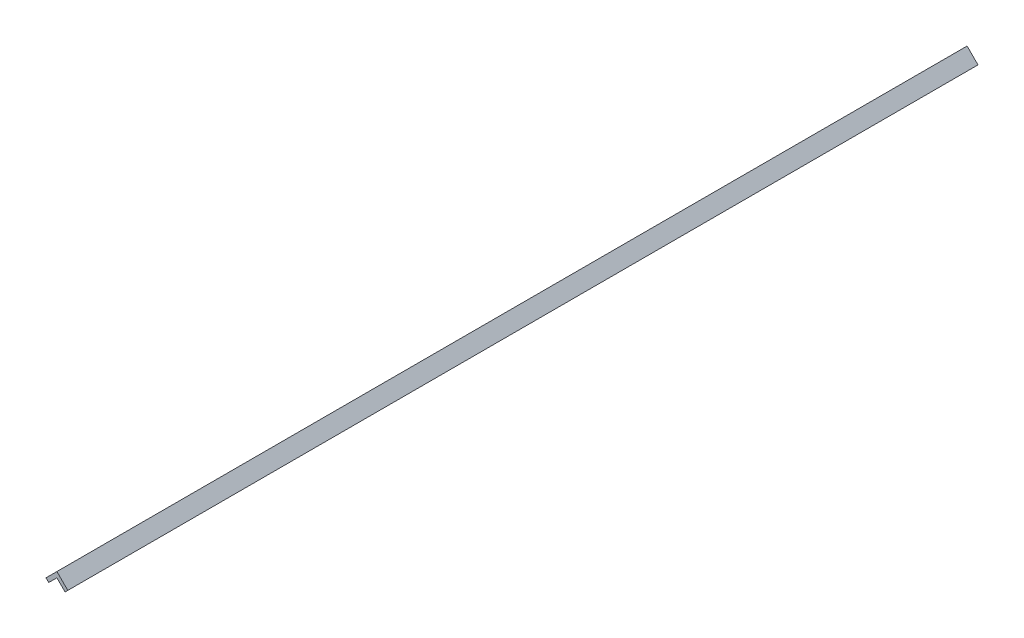
ISO-10303-21;
HEADER;
FILE_DESCRIPTION(('STEP AP214'),'2;1');
FILE_NAME('part.step','',(''),(''),'','','');
FILE_SCHEMA(('AUTOMOTIVE_DESIGN { 1 0 10303 214 1 1 1 1 }'));
ENDSEC;
DATA;
#1=APPLICATION_CONTEXT('core data for automotive mechanical design processes');
#2=APPLICATION_PROTOCOL_DEFINITION('international standard','automotive_design',2000,#1);
#3=PRODUCT_CONTEXT('',#1,'mechanical');
#4=PRODUCT('Part','Part','',(#3));
#5=PRODUCT_RELATED_PRODUCT_CATEGORY('part','',(#4));
#6=PRODUCT_DEFINITION_FORMATION('','',#4);
#7=PRODUCT_DEFINITION_CONTEXT('part definition',#1,'design');
#8=PRODUCT_DEFINITION('design','',#6,#7);
#9=PRODUCT_DEFINITION_SHAPE('','',#8);
#10=(LENGTH_UNIT() NAMED_UNIT(*) SI_UNIT(.MILLI.,.METRE.));
#11=(NAMED_UNIT(*) PLANE_ANGLE_UNIT() SI_UNIT($,.RADIAN.));
#12=(NAMED_UNIT(*) SI_UNIT($,.STERADIAN.) SOLID_ANGLE_UNIT());
#13=UNCERTAINTY_MEASURE_WITH_UNIT(LENGTH_MEASURE(1.E-05),#10,'distance_accuracy_value','');
#14=(GEOMETRIC_REPRESENTATION_CONTEXT(3) GLOBAL_UNCERTAINTY_ASSIGNED_CONTEXT((#13)) GLOBAL_UNIT_ASSIGNED_CONTEXT((#10,
#11,#12)) REPRESENTATION_CONTEXT('',''));
#15=CARTESIAN_POINT('',(0.,0.,0.));
#16=DIRECTION('',(0.,0.,1.));
#17=DIRECTION('',(1.,0.,0.));
#18=AXIS2_PLACEMENT_3D('',#15,#16,#17);
#19=CARTESIAN_POINT('',(0.,11.2288556852424,750.));
#20=DIRECTION('',(0.707106781186547,-0.707106781186548,0.));
#21=DIRECTION('',(0.707106781186548,0.707106781186547,0.));
#22=AXIS2_PLACEMENT_3D('',#19,#20,#21);
#23=PLANE('',#22);
#24=DIRECTION('',(-0.707106781186548,-0.707106781186547,0.));
#25=VECTOR('',#24,1.);
#26=CARTESIAN_POINT('',(0.,11.2288556852424,0.));
#27=LINE('',#26,#25);
#28=CARTESIAN_POINT('',(0.,11.2288556852424,0.));
#29=VERTEX_POINT('',#28);
#30=CARTESIAN_POINT('',(-8.98025612106915,2.24859956417322,0.));
#31=VERTEX_POINT('',#30);
#32=EDGE_CURVE('E119',#29,#31,#27,.T.);
#33=ORIENTED_EDGE('',*,*,#32,.T.);
#34=DIRECTION('',(0.,0.,-1.));
#35=VECTOR('',#34,1.);
#36=CARTESIAN_POINT('',(-8.98025612106906,2.24859956417322,750.));
#37=LINE('',#36,#35);
#38=CARTESIAN_POINT('',(-8.98025612106906,2.24859956417322,750.));
#39=VERTEX_POINT('',#38);
#40=EDGE_CURVE('E11',#39,#31,#37,.T.);
#41=ORIENTED_EDGE('',*,*,#40,.F.);
#42=DIRECTION('',(-0.707106781186548,-0.707106781186547,0.));
#43=VECTOR('',#42,1.);
#44=CARTESIAN_POINT('',(0.,11.2288556852424,750.));
#45=LINE('',#44,#43);
#46=CARTESIAN_POINT('',(0.,11.2288556852424,750.));
#47=VERTEX_POINT('',#46);
#48=EDGE_CURVE('E129',#47,#39,#45,.T.);
#49=ORIENTED_EDGE('',*,*,#48,.F.);
#50=DIRECTION('',(0.,0.,-1.));
#51=VECTOR('',#50,1.);
#52=CARTESIAN_POINT('',(0.,11.2288556852424,750.));
#53=LINE('',#52,#51);
#54=EDGE_CURVE('E115',#47,#29,#53,.T.);
#55=ORIENTED_EDGE('',*,*,#54,.T.);
#56=EDGE_LOOP('',(#33,#41,#49,#55));
#57=FACE_BOUND('',#56,.T.);
#58=ADVANCED_FACE('F35',(#57),#23,.F.);
#59=CARTESIAN_POINT('',(-8.98025612106906,2.24859956417322,750.));
#60=DIRECTION('',(0.707106781186548,0.707106781186547,0.));
#61=DIRECTION('',(-0.707106781186547,0.707106781186548,0.));
#62=AXIS2_PLACEMENT_3D('',#59,#60,#61);
#63=PLANE('',#62);
#64=DIRECTION('',(0.707106781186547,-0.707106781186548,0.));
#65=VECTOR('',#64,1.);
#66=CARTESIAN_POINT('',(-8.98025612106915,2.24859956417322,0.));
#67=LINE('',#66,#65);
#68=CARTESIAN_POINT('',(-6.73165655689593,0.,0.));
#69=VERTEX_POINT('',#68);
#70=EDGE_CURVE('E122',#31,#69,#67,.T.);
#71=ORIENTED_EDGE('',*,*,#70,.T.);
#72=DIRECTION('',(0.,0.,-1.));
#73=VECTOR('',#72,1.);
#74=CARTESIAN_POINT('',(-6.73165655689584,0.,750.));
#75=LINE('',#74,#73);
#76=CARTESIAN_POINT('',(-6.73165655689584,0.,750.));
#77=VERTEX_POINT('',#76);
#78=EDGE_CURVE('E43',#77,#69,#75,.T.);
#79=ORIENTED_EDGE('',*,*,#78,.F.);
#80=DIRECTION('',(0.707106781186547,-0.707106781186548,0.));
#81=VECTOR('',#80,1.);
#82=CARTESIAN_POINT('',(-8.98025612106906,2.24859956417322,750.));
#83=LINE('',#82,#81);
#84=EDGE_CURVE('E88',#39,#77,#83,.T.);
#85=ORIENTED_EDGE('',*,*,#84,.F.);
#86=ORIENTED_EDGE('',*,*,#40,.T.);
#87=EDGE_LOOP('',(#71,#79,#85,#86));
#88=FACE_BOUND('',#87,.T.);
#89=ADVANCED_FACE('F153',(#88),#63,.F.);
#90=CARTESIAN_POINT('',(-6.73165655689584,0.,750.));
#91=DIRECTION('',(-0.707106781186548,0.707106781186547,0.));
#92=DIRECTION('',(-0.707106781186547,-0.707106781186548,0.));
#93=AXIS2_PLACEMENT_3D('',#90,#91,#92);
#94=PLANE('',#93);
#95=DIRECTION('',(0.707106781186547,0.707106781186548,0.));
#96=VECTOR('',#95,1.);
#97=CARTESIAN_POINT('',(-6.73165655689593,0.,0.));
#98=LINE('',#97,#96);
#99=CARTESIAN_POINT('',(0.,6.73165655689594,0.));
#100=VERTEX_POINT('',#99);
#101=EDGE_CURVE('E124',#69,#100,#98,.T.);
#102=ORIENTED_EDGE('',*,*,#101,.T.);
#103=DIRECTION('',(0.,0.,-1.));
#104=VECTOR('',#103,1.);
#105=CARTESIAN_POINT('',(0.,6.73165655689594,750.));
#106=LINE('',#105,#104);
#107=CARTESIAN_POINT('',(0.,6.73165655689594,750.));
#108=VERTEX_POINT('',#107);
#109=EDGE_CURVE('E110',#108,#100,#106,.T.);
#110=ORIENTED_EDGE('',*,*,#109,.F.);
#111=DIRECTION('',(0.707106781186547,0.707106781186548,0.));
#112=VECTOR('',#111,1.);
#113=CARTESIAN_POINT('',(-6.73165655689584,0.,750.));
#114=LINE('',#113,#112);
#115=EDGE_CURVE('E101',#77,#108,#114,.T.);
#116=ORIENTED_EDGE('',*,*,#115,.F.);
#117=ORIENTED_EDGE('',*,*,#78,.T.);
#118=EDGE_LOOP('',(#102,#110,#116,#117));
#119=FACE_BOUND('',#118,.T.);
#120=ADVANCED_FACE('F135',(#119),#94,.F.);
#121=CARTESIAN_POINT('',(6.73165655689606,0.,750.));
#122=DIRECTION('',(0.707106781186545,0.70710678118655,0.));
#123=DIRECTION('',(-0.70710678118655,0.707106781186545,0.));
#124=AXIS2_PLACEMENT_3D('',#121,#122,#123);
#125=PLANE('',#124);
#126=DIRECTION('',(0.70710678118655,-0.707106781186545,0.));
#127=VECTOR('',#126,1.);
#128=CARTESIAN_POINT('',(6.73165655689597,0.,0.));
#129=LINE('',#128,#127);
#130=CARTESIAN_POINT('',(6.73165655689597,0.,0.));
#131=VERTEX_POINT('',#130);
#132=EDGE_CURVE('E109',#100,#131,#129,.T.);
#133=ORIENTED_EDGE('',*,*,#132,.T.);
#134=DIRECTION('',(0.,0.,-1.));
#135=VECTOR('',#134,1.);
#136=CARTESIAN_POINT('',(6.73165655689606,0.,750.));
#137=LINE('',#136,#135);
#138=CARTESIAN_POINT('',(6.73165655689606,0.,750.));
#139=VERTEX_POINT('',#138);
#140=EDGE_CURVE('E106',#139,#131,#137,.T.);
#141=ORIENTED_EDGE('',*,*,#140,.F.);
#142=DIRECTION('',(0.70710678118655,-0.707106781186545,0.));
#143=VECTOR('',#142,1.);
#144=CARTESIAN_POINT('',(6.73165655689606,0.,750.));
#145=LINE('',#144,#143);
#146=EDGE_CURVE('E95',#108,#139,#145,.T.);
#147=ORIENTED_EDGE('',*,*,#146,.F.);
#148=ORIENTED_EDGE('',*,*,#109,.T.);
#149=EDGE_LOOP('',(#133,#141,#147,#148));
#150=FACE_BOUND('',#149,.T.);
#151=ADVANCED_FACE('F107',(#150),#125,.F.);
#152=CARTESIAN_POINT('',(8.98025612106927,2.24859956417325,750.));
#153=DIRECTION('',(-0.70710678118655,0.707106781186545,0.));
#154=DIRECTION('',(-0.707106781186545,-0.70710678118655,0.));
#155=AXIS2_PLACEMENT_3D('',#152,#153,#154);
#156=PLANE('',#155);
#157=DIRECTION('',(0.707106781186545,0.70710678118655,0.));
#158=VECTOR('',#157,1.);
#159=CARTESIAN_POINT('',(8.98025612106918,2.24859956417325,0.));
#160=LINE('',#159,#158);
#161=CARTESIAN_POINT('',(8.98025612106918,2.24859956417325,0.));
#162=VERTEX_POINT('',#161);
#163=EDGE_CURVE('E74',#131,#162,#160,.T.);
#164=ORIENTED_EDGE('',*,*,#163,.T.);
#165=DIRECTION('',(0.,0.,-1.));
#166=VECTOR('',#165,1.);
#167=CARTESIAN_POINT('',(8.98025612106927,2.24859956417325,750.));
#168=LINE('',#167,#166);
#169=CARTESIAN_POINT('',(8.98025612106927,2.24859956417325,750.));
#170=VERTEX_POINT('',#169);
#171=EDGE_CURVE('E111',#170,#162,#168,.T.);
#172=ORIENTED_EDGE('',*,*,#171,.F.);
#173=DIRECTION('',(0.707106781186545,0.70710678118655,0.));
#174=VECTOR('',#173,1.);
#175=CARTESIAN_POINT('',(8.98025612106927,2.24859956417325,750.));
#176=LINE('',#175,#174);
#177=EDGE_CURVE('E99',#139,#170,#176,.T.);
#178=ORIENTED_EDGE('',*,*,#177,.F.);
#179=ORIENTED_EDGE('',*,*,#140,.T.);
#180=EDGE_LOOP('',(#164,#172,#178,#179));
#181=FACE_BOUND('',#180,.T.);
#182=ADVANCED_FACE('F113',(#181),#156,.F.);
#183=CARTESIAN_POINT('',(0.,11.2288556852424,750.));
#184=DIRECTION('',(-0.707106781186545,-0.70710678118655,0.));
#185=DIRECTION('',(0.70710678118655,-0.707106781186545,0.));
#186=AXIS2_PLACEMENT_3D('',#183,#184,#185);
#187=PLANE('',#186);
#188=DIRECTION('',(-0.70710678118655,0.707106781186545,0.));
#189=VECTOR('',#188,1.);
#190=CARTESIAN_POINT('',(0.,11.2288556852424,0.));
#191=LINE('',#190,#189);
#192=EDGE_CURVE('E80',#162,#29,#191,.T.);
#193=ORIENTED_EDGE('',*,*,#192,.T.);
#194=ORIENTED_EDGE('',*,*,#54,.F.);
#195=DIRECTION('',(-0.70710678118655,0.707106781186545,0.));
#196=VECTOR('',#195,1.);
#197=CARTESIAN_POINT('',(0.,11.2288556852424,750.));
#198=LINE('',#197,#196);
#199=EDGE_CURVE('E51',#170,#47,#198,.T.);
#200=ORIENTED_EDGE('',*,*,#199,.F.);
#201=ORIENTED_EDGE('',*,*,#171,.T.);
#202=EDGE_LOOP('',(#193,#194,#200,#201));
#203=FACE_BOUND('',#202,.T.);
#204=ADVANCED_FACE('F142',(#203),#187,.F.);
#205=CARTESIAN_POINT('',(0.,0.,750.));
#206=DIRECTION('',(0.,0.,1.));
#207=DIRECTION('',(1.,0.,0.));
#208=AXIS2_PLACEMENT_3D('',#205,#206,#207);
#209=PLANE('',#208);
#210=ORIENTED_EDGE('',*,*,#48,.T.);
#211=ORIENTED_EDGE('',*,*,#84,.T.);
#212=ORIENTED_EDGE('',*,*,#115,.T.);
#213=ORIENTED_EDGE('',*,*,#146,.T.);
#214=ORIENTED_EDGE('',*,*,#177,.T.);
#215=ORIENTED_EDGE('',*,*,#199,.T.);
#216=EDGE_LOOP('',(#210,#211,#212,#213,#214,#215));
#217=FACE_BOUND('',#216,.T.);
#218=ADVANCED_FACE('F97',(#217),#209,.T.);
#219=CARTESIAN_POINT('',(0.,0.,0.));
#220=DIRECTION('',(0.,0.,1.));
#221=DIRECTION('',(1.,0.,0.));
#222=AXIS2_PLACEMENT_3D('',#219,#220,#221);
#223=PLANE('',#222);
#224=ORIENTED_EDGE('',*,*,#32,.F.);
#225=ORIENTED_EDGE('',*,*,#192,.F.);
#226=ORIENTED_EDGE('',*,*,#163,.F.);
#227=ORIENTED_EDGE('',*,*,#132,.F.);
#228=ORIENTED_EDGE('',*,*,#101,.F.);
#229=ORIENTED_EDGE('',*,*,#70,.F.);
#230=EDGE_LOOP('',(#224,#225,#226,#227,#228,#229));
#231=FACE_BOUND('',#230,.T.);
#232=ADVANCED_FACE('F138',(#231),#223,.F.);
#233=CLOSED_SHELL('',(#58,#89,#120,#151,#182,#204,#218,#232));
#234=MANIFOLD_SOLID_BREP('B2',#233);
#235=ADVANCED_BREP_SHAPE_REPRESENTATION('',(#18,#234),#14);
#236=SHAPE_DEFINITION_REPRESENTATION(#9,#235);
ENDSEC;
END-ISO-10303-21;
